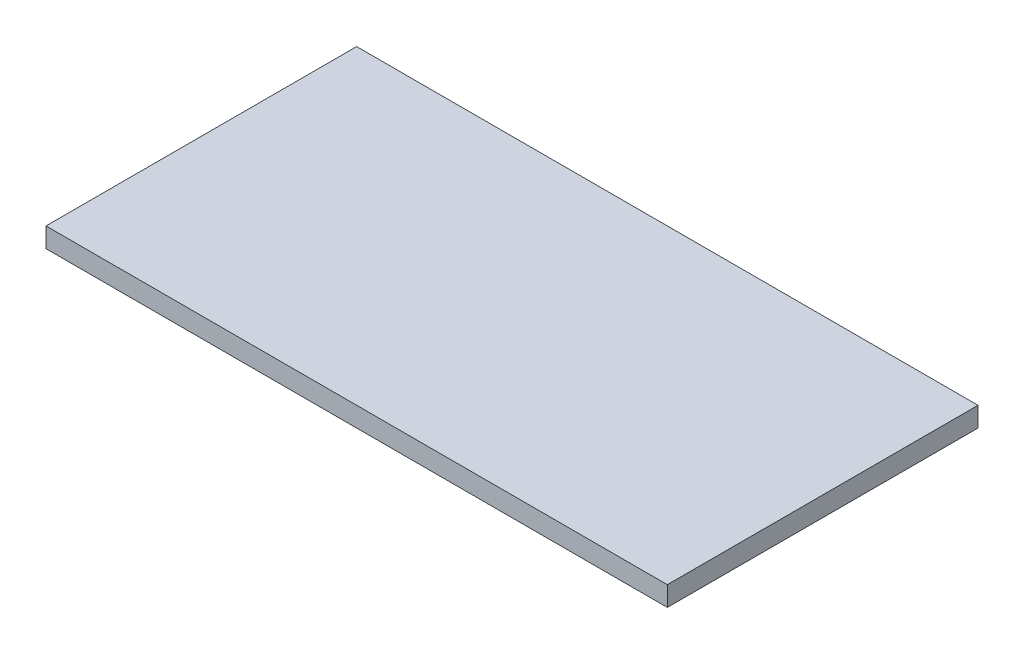
ISO-10303-21;
HEADER;
FILE_DESCRIPTION(('STEP AP214'),'2;1');
FILE_NAME('part.step','',(''),(''),'','','');
FILE_SCHEMA(('AUTOMOTIVE_DESIGN { 1 0 10303 214 1 1 1 1 }'));
ENDSEC;
DATA;
#1=APPLICATION_CONTEXT('core data for automotive mechanical design processes');
#2=APPLICATION_PROTOCOL_DEFINITION('international standard','automotive_design',2000,#1);
#3=PRODUCT_CONTEXT('',#1,'mechanical');
#4=PRODUCT('Part','Part','',(#3));
#5=PRODUCT_RELATED_PRODUCT_CATEGORY('part','',(#4));
#6=PRODUCT_DEFINITION_FORMATION('','',#4);
#7=PRODUCT_DEFINITION_CONTEXT('part definition',#1,'design');
#8=PRODUCT_DEFINITION('design','',#6,#7);
#9=PRODUCT_DEFINITION_SHAPE('','',#8);
#10=(LENGTH_UNIT() NAMED_UNIT(*) SI_UNIT(.MILLI.,.METRE.));
#11=(NAMED_UNIT(*) PLANE_ANGLE_UNIT() SI_UNIT($,.RADIAN.));
#12=(NAMED_UNIT(*) SI_UNIT($,.STERADIAN.) SOLID_ANGLE_UNIT());
#13=UNCERTAINTY_MEASURE_WITH_UNIT(LENGTH_MEASURE(1.E-05),#10,'distance_accuracy_value','');
#14=(GEOMETRIC_REPRESENTATION_CONTEXT(3) GLOBAL_UNCERTAINTY_ASSIGNED_CONTEXT((#13)) GLOBAL_UNIT_ASSIGNED_CONTEXT((#10,
#11,#12)) REPRESENTATION_CONTEXT('',''));
#15=CARTESIAN_POINT('',(0.,0.,0.));
#16=DIRECTION('',(0.,0.,1.));
#17=DIRECTION('',(1.,0.,0.));
#18=AXIS2_PLACEMENT_3D('',#15,#16,#17);
#19=CARTESIAN_POINT('',(49.9999999999999,3.175,25.));
#20=DIRECTION('',(-1.,0.,0.));
#21=DIRECTION('',(0.,0.,1.));
#22=AXIS2_PLACEMENT_3D('',#19,#20,#21);
#23=PLANE('',#22);
#24=DIRECTION('',(0.,0.,-1.));
#25=VECTOR('',#24,1.);
#26=CARTESIAN_POINT('',(49.9999999999999,0.,25.));
#27=LINE('',#26,#25);
#28=CARTESIAN_POINT('',(49.9999999999999,0.,25.));
#29=VERTEX_POINT('',#28);
#30=CARTESIAN_POINT('',(49.9999999999999,0.,-25.));
#31=VERTEX_POINT('',#30);
#32=EDGE_CURVE('E99',#29,#31,#27,.T.);
#33=ORIENTED_EDGE('',*,*,#32,.T.);
#34=DIRECTION('',(0.,-1.,0.));
#35=VECTOR('',#34,1.);
#36=CARTESIAN_POINT('',(49.9999999999999,3.175,-25.));
#37=LINE('',#36,#35);
#38=CARTESIAN_POINT('',(49.9999999999999,3.175,-25.));
#39=VERTEX_POINT('',#38);
#40=EDGE_CURVE('E11',#39,#31,#37,.T.);
#41=ORIENTED_EDGE('',*,*,#40,.F.);
#42=DIRECTION('',(0.,0.,-1.));
#43=VECTOR('',#42,1.);
#44=CARTESIAN_POINT('',(49.9999999999999,3.175,25.));
#45=LINE('',#44,#43);
#46=CARTESIAN_POINT('',(49.9999999999999,3.175,25.));
#47=VERTEX_POINT('',#46);
#48=EDGE_CURVE('E87',#47,#39,#45,.T.);
#49=ORIENTED_EDGE('',*,*,#48,.F.);
#50=DIRECTION('',(0.,-1.,0.));
#51=VECTOR('',#50,1.);
#52=CARTESIAN_POINT('',(49.9999999999999,3.175,25.));
#53=LINE('',#52,#51);
#54=EDGE_CURVE('E95',#47,#29,#53,.T.);
#55=ORIENTED_EDGE('',*,*,#54,.T.);
#56=EDGE_LOOP('',(#33,#41,#49,#55));
#57=FACE_BOUND('',#56,.T.);
#58=ADVANCED_FACE('F36',(#57),#23,.F.);
#59=CARTESIAN_POINT('',(-50.0000000000001,3.175,-25.));
#60=DIRECTION('',(0.,0.,1.));
#61=DIRECTION('',(1.,0.,0.));
#62=AXIS2_PLACEMENT_3D('',#59,#60,#61);
#63=PLANE('',#62);
#64=DIRECTION('',(-1.,0.,0.));
#65=VECTOR('',#64,1.);
#66=CARTESIAN_POINT('',(-50.0000000000001,0.,-25.));
#67=LINE('',#66,#65);
#68=CARTESIAN_POINT('',(-50.0000000000001,0.,-25.));
#69=VERTEX_POINT('',#68);
#70=EDGE_CURVE('E91',#31,#69,#67,.T.);
#71=ORIENTED_EDGE('',*,*,#70,.T.);
#72=DIRECTION('',(0.,-1.,0.));
#73=VECTOR('',#72,1.);
#74=CARTESIAN_POINT('',(-50.0000000000001,3.175,-25.));
#75=LINE('',#74,#73);
#76=CARTESIAN_POINT('',(-50.0000000000001,3.175,-25.));
#77=VERTEX_POINT('',#76);
#78=EDGE_CURVE('E44',#77,#69,#75,.T.);
#79=ORIENTED_EDGE('',*,*,#78,.F.);
#80=DIRECTION('',(-1.,0.,0.));
#81=VECTOR('',#80,1.);
#82=CARTESIAN_POINT('',(-50.0000000000001,3.175,-25.));
#83=LINE('',#82,#81);
#84=EDGE_CURVE('E82',#39,#77,#83,.T.);
#85=ORIENTED_EDGE('',*,*,#84,.F.);
#86=ORIENTED_EDGE('',*,*,#40,.T.);
#87=EDGE_LOOP('',(#71,#79,#85,#86));
#88=FACE_BOUND('',#87,.T.);
#89=ADVANCED_FACE('F90',(#88),#63,.F.);
#90=CARTESIAN_POINT('',(-50.0000000000001,3.175,25.));
#91=DIRECTION('',(1.,0.,0.));
#92=DIRECTION('',(0.,0.,-1.));
#93=AXIS2_PLACEMENT_3D('',#90,#91,#92);
#94=PLANE('',#93);
#95=DIRECTION('',(0.,0.,1.));
#96=VECTOR('',#95,1.);
#97=CARTESIAN_POINT('',(-50.0000000000001,0.,25.));
#98=LINE('',#97,#96);
#99=CARTESIAN_POINT('',(-50.0000000000001,0.,25.));
#100=VERTEX_POINT('',#99);
#101=EDGE_CURVE('E69',#69,#100,#98,.T.);
#102=ORIENTED_EDGE('',*,*,#101,.T.);
#103=DIRECTION('',(0.,-1.,0.));
#104=VECTOR('',#103,1.);
#105=CARTESIAN_POINT('',(-50.0000000000001,3.175,25.));
#106=LINE('',#105,#104);
#107=CARTESIAN_POINT('',(-50.0000000000001,3.175,25.));
#108=VERTEX_POINT('',#107);
#109=EDGE_CURVE('E92',#108,#100,#106,.T.);
#110=ORIENTED_EDGE('',*,*,#109,.F.);
#111=DIRECTION('',(0.,0.,1.));
#112=VECTOR('',#111,1.);
#113=CARTESIAN_POINT('',(-50.0000000000001,3.175,25.));
#114=LINE('',#113,#112);
#115=EDGE_CURVE('E85',#77,#108,#114,.T.);
#116=ORIENTED_EDGE('',*,*,#115,.F.);
#117=ORIENTED_EDGE('',*,*,#78,.T.);
#118=EDGE_LOOP('',(#102,#110,#116,#117));
#119=FACE_BOUND('',#118,.T.);
#120=ADVANCED_FACE('F93',(#119),#94,.F.);
#121=CARTESIAN_POINT('',(-50.0000000000001,3.175,25.));
#122=DIRECTION('',(0.,0.,-1.));
#123=DIRECTION('',(-1.,0.,0.));
#124=AXIS2_PLACEMENT_3D('',#121,#122,#123);
#125=PLANE('',#124);
#126=DIRECTION('',(1.,0.,0.));
#127=VECTOR('',#126,1.);
#128=CARTESIAN_POINT('',(-50.0000000000001,0.,25.));
#129=LINE('',#128,#127);
#130=EDGE_CURVE('E75',#100,#29,#129,.T.);
#131=ORIENTED_EDGE('',*,*,#130,.T.);
#132=ORIENTED_EDGE('',*,*,#54,.F.);
#133=DIRECTION('',(1.,0.,0.));
#134=VECTOR('',#133,1.);
#135=CARTESIAN_POINT('',(-50.0000000000001,3.175,25.));
#136=LINE('',#135,#134);
#137=EDGE_CURVE('E52',#108,#47,#136,.T.);
#138=ORIENTED_EDGE('',*,*,#137,.F.);
#139=ORIENTED_EDGE('',*,*,#109,.T.);
#140=EDGE_LOOP('',(#131,#132,#138,#139));
#141=FACE_BOUND('',#140,.T.);
#142=ADVANCED_FACE('F106',(#141),#125,.F.);
#143=CARTESIAN_POINT('',(0.,3.175,0.));
#144=DIRECTION('',(0.,-1.,0.));
#145=DIRECTION('',(0.,0.,-1.));
#146=AXIS2_PLACEMENT_3D('',#143,#144,#145);
#147=PLANE('',#146);
#148=ORIENTED_EDGE('',*,*,#48,.T.);
#149=ORIENTED_EDGE('',*,*,#84,.T.);
#150=ORIENTED_EDGE('',*,*,#115,.T.);
#151=ORIENTED_EDGE('',*,*,#137,.T.);
#152=EDGE_LOOP('',(#148,#149,#150,#151));
#153=FACE_BOUND('',#152,.T.);
#154=ADVANCED_FACE('F83',(#153),#147,.F.);
#155=CARTESIAN_POINT('',(0.,0.,0.));
#156=DIRECTION('',(0.,-1.,0.));
#157=DIRECTION('',(0.,0.,-1.));
#158=AXIS2_PLACEMENT_3D('',#155,#156,#157);
#159=PLANE('',#158);
#160=ORIENTED_EDGE('',*,*,#32,.F.);
#161=ORIENTED_EDGE('',*,*,#130,.F.);
#162=ORIENTED_EDGE('',*,*,#101,.F.);
#163=ORIENTED_EDGE('',*,*,#70,.F.);
#164=EDGE_LOOP('',(#160,#161,#162,#163));
#165=FACE_BOUND('',#164,.T.);
#166=ADVANCED_FACE('F109',(#165),#159,.T.);
#167=CLOSED_SHELL('',(#58,#89,#120,#142,#154,#166));
#168=MANIFOLD_SOLID_BREP('B2',#167);
#169=ADVANCED_BREP_SHAPE_REPRESENTATION('',(#18,#168),#14);
#170=SHAPE_DEFINITION_REPRESENTATION(#9,#169);
ENDSEC;
END-ISO-10303-21;
